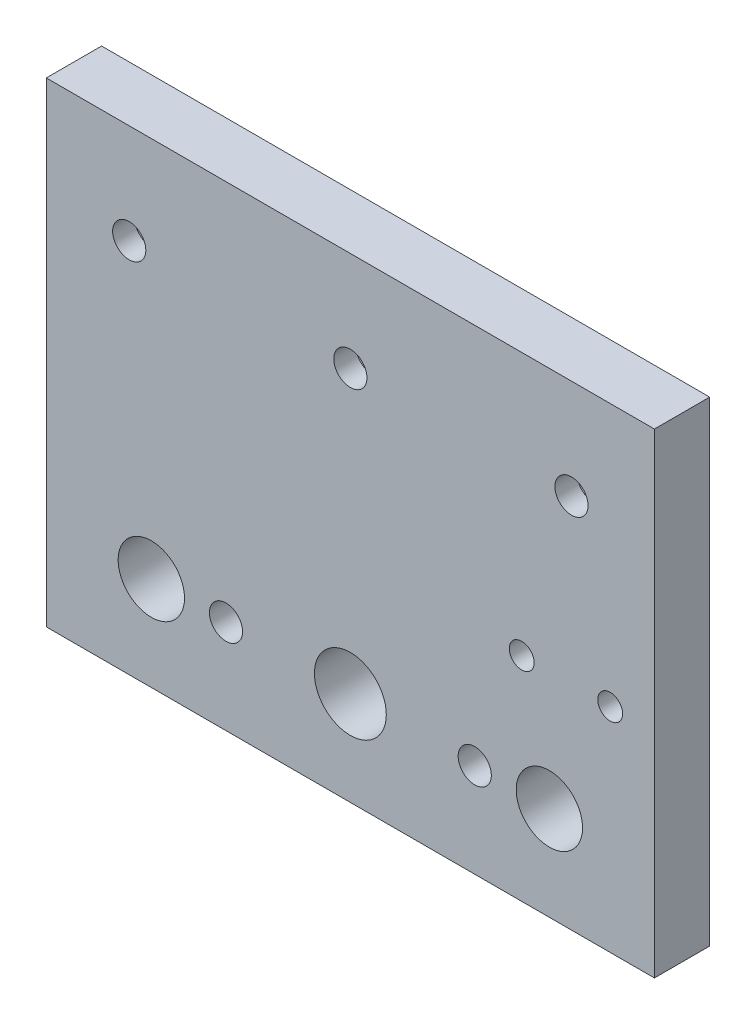
ISO-10303-21;
HEADER;
FILE_DESCRIPTION(('STEP AP214'),'2;1');
FILE_NAME('part.step','',(''),(''),'','','');
FILE_SCHEMA(('AUTOMOTIVE_DESIGN { 1 0 10303 214 1 1 1 1 }'));
ENDSEC;
DATA;
#1=APPLICATION_CONTEXT('core data for automotive mechanical design processes');
#2=APPLICATION_PROTOCOL_DEFINITION('international standard','automotive_design',2000,#1);
#3=PRODUCT_CONTEXT('',#1,'mechanical');
#4=PRODUCT('Part','Part','',(#3));
#5=PRODUCT_RELATED_PRODUCT_CATEGORY('part','',(#4));
#6=PRODUCT_DEFINITION_FORMATION('','',#4);
#7=PRODUCT_DEFINITION_CONTEXT('part definition',#1,'design');
#8=PRODUCT_DEFINITION('design','',#6,#7);
#9=PRODUCT_DEFINITION_SHAPE('','',#8);
#10=(LENGTH_UNIT() NAMED_UNIT(*) SI_UNIT(.MILLI.,.METRE.));
#11=(NAMED_UNIT(*) PLANE_ANGLE_UNIT() SI_UNIT($,.RADIAN.));
#12=(NAMED_UNIT(*) SI_UNIT($,.STERADIAN.) SOLID_ANGLE_UNIT());
#13=UNCERTAINTY_MEASURE_WITH_UNIT(LENGTH_MEASURE(1.E-05),#10,'distance_accuracy_value','');
#14=(GEOMETRIC_REPRESENTATION_CONTEXT(3) GLOBAL_UNCERTAINTY_ASSIGNED_CONTEXT((#13)) GLOBAL_UNIT_ASSIGNED_CONTEXT((#10,
#11,#12)) REPRESENTATION_CONTEXT('',''));
#15=CARTESIAN_POINT('',(0.,0.,0.));
#16=DIRECTION('',(0.,0.,1.));
#17=DIRECTION('',(1.,0.,0.));
#18=AXIS2_PLACEMENT_3D('',#15,#16,#17);
#19=CARTESIAN_POINT('',(0.,25.,10.0000000000001));
#20=DIRECTION('',(0.,0.,-1.));
#21=DIRECTION('',(-1.,0.,0.));
#22=AXIS2_PLACEMENT_3D('',#19,#20,#21);
#23=CYLINDRICAL_SURFACE('',#22,3.);
#24=CARTESIAN_POINT('',(0.,25.,10.0000000000001));
#25=DIRECTION('',(0.,0.,1.));
#26=DIRECTION('',(1.,0.,0.));
#27=AXIS2_PLACEMENT_3D('',#24,#25,#26);
#28=CIRCLE('',#27,3.);
#29=CARTESIAN_POINT('',(3.,25.,10.0000000000001));
#30=VERTEX_POINT('',#29);
#31=EDGE_CURVE('E126',#30,#30,#28,.T.);
#32=ORIENTED_EDGE('',*,*,#31,.T.);
#33=EDGE_LOOP('',(#32));
#34=FACE_BOUND('',#33,.T.);
#35=CARTESIAN_POINT('',(0.,25.,6.));
#36=DIRECTION('',(0.,0.,-1.));
#37=DIRECTION('',(-1.,0.,0.));
#38=AXIS2_PLACEMENT_3D('',#35,#36,#37);
#39=CIRCLE('',#38,3.);
#40=CARTESIAN_POINT('',(-3.,25.,6.));
#41=VERTEX_POINT('',#40);
#42=EDGE_CURVE('E21',#41,#41,#39,.T.);
#43=ORIENTED_EDGE('',*,*,#42,.T.);
#44=EDGE_LOOP('',(#43));
#45=FACE_BOUND('',#44,.T.);
#46=ADVANCED_FACE('F17',(#34,#45),#23,.F.);
#47=CARTESIAN_POINT('',(40.,25.,10.));
#48=DIRECTION('',(0.,0.,-1.));
#49=DIRECTION('',(-1.,0.,0.));
#50=AXIS2_PLACEMENT_3D('',#47,#48,#49);
#51=CYLINDRICAL_SURFACE('',#50,3.);
#52=CARTESIAN_POINT('',(40.,25.,10.));
#53=DIRECTION('',(0.,0.,1.));
#54=DIRECTION('',(1.,0.,0.));
#55=AXIS2_PLACEMENT_3D('',#52,#53,#54);
#56=CIRCLE('',#55,3.);
#57=CARTESIAN_POINT('',(43.,25.,10.));
#58=VERTEX_POINT('',#57);
#59=EDGE_CURVE('E123',#58,#58,#56,.T.);
#60=ORIENTED_EDGE('',*,*,#59,.T.);
#61=EDGE_LOOP('',(#60));
#62=FACE_BOUND('',#61,.T.);
#63=CARTESIAN_POINT('',(40.,25.,5.99999999999989));
#64=DIRECTION('',(0.,0.,-1.));
#65=DIRECTION('',(-1.,0.,0.));
#66=AXIS2_PLACEMENT_3D('',#63,#64,#65);
#67=CIRCLE('',#66,3.);
#68=CARTESIAN_POINT('',(37.,25.,5.99999999999989));
#69=VERTEX_POINT('',#68);
#70=EDGE_CURVE('E96',#69,#69,#67,.T.);
#71=ORIENTED_EDGE('',*,*,#70,.T.);
#72=EDGE_LOOP('',(#71));
#73=FACE_BOUND('',#72,.T.);
#74=ADVANCED_FACE('F180',(#62,#73),#51,.F.);
#75=CARTESIAN_POINT('',(-40.,25.,10.));
#76=DIRECTION('',(0.,0.,-1.));
#77=DIRECTION('',(-1.,0.,0.));
#78=AXIS2_PLACEMENT_3D('',#75,#76,#77);
#79=CYLINDRICAL_SURFACE('',#78,3.);
#80=CARTESIAN_POINT('',(-40.,25.,10.));
#81=DIRECTION('',(0.,0.,1.));
#82=DIRECTION('',(1.,0.,0.));
#83=AXIS2_PLACEMENT_3D('',#80,#81,#82);
#84=CIRCLE('',#83,3.);
#85=CARTESIAN_POINT('',(-37.,25.,10.));
#86=VERTEX_POINT('',#85);
#87=EDGE_CURVE('E118',#86,#86,#84,.T.);
#88=ORIENTED_EDGE('',*,*,#87,.T.);
#89=EDGE_LOOP('',(#88));
#90=FACE_BOUND('',#89,.T.);
#91=CARTESIAN_POINT('',(-40.,25.,6.00000000000009));
#92=DIRECTION('',(0.,0.,-1.));
#93=DIRECTION('',(-1.,0.,0.));
#94=AXIS2_PLACEMENT_3D('',#91,#92,#93);
#95=CIRCLE('',#94,3.);
#96=CARTESIAN_POINT('',(-43.,25.,6.00000000000009));
#97=VERTEX_POINT('',#96);
#98=EDGE_CURVE('E94',#97,#97,#95,.T.);
#99=ORIENTED_EDGE('',*,*,#98,.T.);
#100=EDGE_LOOP('',(#99));
#101=FACE_BOUND('',#100,.T.);
#102=ADVANCED_FACE('F187',(#90,#101),#79,.F.);
#103=CARTESIAN_POINT('',(0.,-1.11022302462516E-13,10.));
#104=DIRECTION('',(0.,0.,-1.));
#105=DIRECTION('',(-1.,0.,0.));
#106=AXIS2_PLACEMENT_3D('',#103,#104,#105);
#107=PLANE('',#106);
#108=DIRECTION('',(0.,-1.,0.));
#109=VECTOR('',#108,1.);
#110=CARTESIAN_POINT('',(-55.,43.,10.));
#111=LINE('',#110,#109);
#112=CARTESIAN_POINT('',(-55.,43.,10.));
#113=VERTEX_POINT('',#112);
#114=CARTESIAN_POINT('',(-55.,-43.,10.0000000000002));
#115=VERTEX_POINT('',#114);
#116=EDGE_CURVE('E72',#113,#115,#111,.T.);
#117=ORIENTED_EDGE('',*,*,#116,.T.);
#118=DIRECTION('',(1.,0.,0.));
#119=VECTOR('',#118,1.);
#120=CARTESIAN_POINT('',(55.,-43.,10.0000000000002));
#121=LINE('',#120,#119);
#122=CARTESIAN_POINT('',(55.,-43.,10.0000000000002));
#123=VERTEX_POINT('',#122);
#124=EDGE_CURVE('E66',#115,#123,#121,.T.);
#125=ORIENTED_EDGE('',*,*,#124,.T.);
#126=DIRECTION('',(0.,1.,0.));
#127=VECTOR('',#126,1.);
#128=CARTESIAN_POINT('',(55.,43.,10.));
#129=LINE('',#128,#127);
#130=CARTESIAN_POINT('',(55.,43.,10.));
#131=VERTEX_POINT('',#130);
#132=EDGE_CURVE('E70',#123,#131,#129,.T.);
#133=ORIENTED_EDGE('',*,*,#132,.T.);
#134=DIRECTION('',(-1.,0.,0.));
#135=VECTOR('',#134,1.);
#136=CARTESIAN_POINT('',(55.,43.,10.));
#137=LINE('',#136,#135);
#138=EDGE_CURVE('E36',#131,#113,#137,.T.);
#139=ORIENTED_EDGE('',*,*,#138,.T.);
#140=EDGE_LOOP('',(#117,#125,#133,#139));
#141=FACE_BOUND('',#140,.T.);
#142=CARTESIAN_POINT('',(36.,-26.,10.0000000000001));
#143=DIRECTION('',(0.,0.,1.));
#144=DIRECTION('',(1.,0.,0.));
#145=AXIS2_PLACEMENT_3D('',#142,#143,#144);
#146=CIRCLE('',#145,6.);
#147=CARTESIAN_POINT('',(42.,-26.,10.0000000000001));
#148=VERTEX_POINT('',#147);
#149=EDGE_CURVE('E88',#148,#148,#146,.T.);
#150=ORIENTED_EDGE('',*,*,#149,.F.);
#151=EDGE_LOOP('',(#150));
#152=FACE_BOUND('',#151,.T.);
#153=CARTESIAN_POINT('',(0.,-26.,10.0000000000002));
#154=DIRECTION('',(0.,0.,1.));
#155=DIRECTION('',(1.,0.,0.));
#156=AXIS2_PLACEMENT_3D('',#153,#154,#155);
#157=CIRCLE('',#156,6.5);
#158=CARTESIAN_POINT('',(6.50000000000003,-26.,10.0000000000002));
#159=VERTEX_POINT('',#158);
#160=EDGE_CURVE('E148',#159,#159,#157,.T.);
#161=ORIENTED_EDGE('',*,*,#160,.F.);
#162=EDGE_LOOP('',(#161));
#163=FACE_BOUND('',#162,.T.);
#164=CARTESIAN_POINT('',(-36.,-26.,10.0000000000002));
#165=DIRECTION('',(0.,0.,1.));
#166=DIRECTION('',(1.,0.,0.));
#167=AXIS2_PLACEMENT_3D('',#164,#165,#166);
#168=CIRCLE('',#167,6.);
#169=CARTESIAN_POINT('',(-30.,-26.,10.0000000000002));
#170=VERTEX_POINT('',#169);
#171=EDGE_CURVE('E142',#170,#170,#168,.T.);
#172=ORIENTED_EDGE('',*,*,#171,.F.);
#173=EDGE_LOOP('',(#172));
#174=FACE_BOUND('',#173,.T.);
#175=CARTESIAN_POINT('',(22.5,-26.,10.0000000000001));
#176=DIRECTION('',(0.,0.,1.));
#177=DIRECTION('',(1.,0.,0.));
#178=AXIS2_PLACEMENT_3D('',#175,#176,#177);
#179=CIRCLE('',#178,3.);
#180=CARTESIAN_POINT('',(25.5,-26.,10.0000000000001));
#181=VERTEX_POINT('',#180);
#182=EDGE_CURVE('E136',#181,#181,#179,.T.);
#183=ORIENTED_EDGE('',*,*,#182,.F.);
#184=EDGE_LOOP('',(#183));
#185=FACE_BOUND('',#184,.T.);
#186=CARTESIAN_POINT('',(-22.5,-26.,10.0000000000002));
#187=DIRECTION('',(0.,0.,1.));
#188=DIRECTION('',(1.,0.,0.));
#189=AXIS2_PLACEMENT_3D('',#186,#187,#188);
#190=CIRCLE('',#189,3.);
#191=CARTESIAN_POINT('',(-19.5,-26.,10.0000000000002));
#192=VERTEX_POINT('',#191);
#193=EDGE_CURVE('E130',#192,#192,#190,.T.);
#194=ORIENTED_EDGE('',*,*,#193,.F.);
#195=EDGE_LOOP('',(#194));
#196=FACE_BOUND('',#195,.T.);
#197=ORIENTED_EDGE('',*,*,#31,.F.);
#198=EDGE_LOOP('',(#197));
#199=FACE_BOUND('',#198,.T.);
#200=ORIENTED_EDGE('',*,*,#59,.F.);
#201=EDGE_LOOP('',(#200));
#202=FACE_BOUND('',#201,.T.);
#203=ORIENTED_EDGE('',*,*,#87,.F.);
#204=EDGE_LOOP('',(#203));
#205=FACE_BOUND('',#204,.T.);
#206=CARTESIAN_POINT('',(47.,-4.5,10.));
#207=DIRECTION('',(0.,0.,1.));
#208=DIRECTION('',(1.,0.,0.));
#209=AXIS2_PLACEMENT_3D('',#206,#207,#208);
#210=CIRCLE('',#209,2.25);
#211=CARTESIAN_POINT('',(49.25,-4.5,10.));
#212=VERTEX_POINT('',#211);
#213=EDGE_CURVE('E115',#212,#212,#210,.T.);
#214=ORIENTED_EDGE('',*,*,#213,.F.);
#215=EDGE_LOOP('',(#214));
#216=FACE_BOUND('',#215,.T.);
#217=CARTESIAN_POINT('',(31.,-4.5000000000001,10.));
#218=DIRECTION('',(0.,0.,1.));
#219=DIRECTION('',(1.,0.,0.));
#220=AXIS2_PLACEMENT_3D('',#217,#218,#219);
#221=CIRCLE('',#220,2.25);
#222=CARTESIAN_POINT('',(33.25,-4.5000000000001,10.));
#223=VERTEX_POINT('',#222);
#224=EDGE_CURVE('E106',#223,#223,#221,.T.);
#225=ORIENTED_EDGE('',*,*,#224,.F.);
#226=EDGE_LOOP('',(#225));
#227=FACE_BOUND('',#226,.T.);
#228=ADVANCED_FACE('F67',(#141,#152,#163,#174,#185,#196,#199,#202,#205,#216,#227),#107,.F.);
#229=CARTESIAN_POINT('',(0.,0.,0.));
#230=DIRECTION('',(0.,0.,-1.));
#231=DIRECTION('',(-1.,0.,0.));
#232=AXIS2_PLACEMENT_3D('',#229,#230,#231);
#233=PLANE('',#232);
#234=CARTESIAN_POINT('',(40.,25.,-1.94289029309402E-13));
#235=DIRECTION('',(0.,0.,-1.));
#236=DIRECTION('',(-1.,0.,0.));
#237=AXIS2_PLACEMENT_3D('',#234,#235,#236);
#238=CIRCLE('',#237,5.5);
#239=CARTESIAN_POINT('',(34.5,25.,-1.91698499658684E-13));
#240=VERTEX_POINT('',#239);
#241=EDGE_CURVE('E404',#240,#240,#238,.T.);
#242=ORIENTED_EDGE('',*,*,#241,.F.);
#243=EDGE_LOOP('',(#242));
#244=FACE_BOUND('',#243,.T.);
#245=CARTESIAN_POINT('',(0.,25.,0.));
#246=DIRECTION('',(0.,0.,-1.));
#247=DIRECTION('',(-1.,0.,0.));
#248=AXIS2_PLACEMENT_3D('',#245,#246,#247);
#249=CIRCLE('',#248,5.5);
#250=CARTESIAN_POINT('',(-5.5,25.,0.));
#251=VERTEX_POINT('',#250);
#252=EDGE_CURVE('E396',#251,#251,#249,.T.);
#253=ORIENTED_EDGE('',*,*,#252,.F.);
#254=EDGE_LOOP('',(#253));
#255=FACE_BOUND('',#254,.T.);
#256=CARTESIAN_POINT('',(-40.,25.,0.));
#257=DIRECTION('',(0.,0.,-1.));
#258=DIRECTION('',(-1.,0.,0.));
#259=AXIS2_PLACEMENT_3D('',#256,#257,#258);
#260=CIRCLE('',#259,5.5);
#261=CARTESIAN_POINT('',(-45.5,25.,0.));
#262=VERTEX_POINT('',#261);
#263=EDGE_CURVE('E394',#262,#262,#260,.T.);
#264=ORIENTED_EDGE('',*,*,#263,.F.);
#265=EDGE_LOOP('',(#264));
#266=FACE_BOUND('',#265,.T.);
#267=CARTESIAN_POINT('',(47.,-4.5000000000001,0.));
#268=DIRECTION('',(0.,0.,1.));
#269=DIRECTION('',(1.,0.,0.));
#270=AXIS2_PLACEMENT_3D('',#267,#268,#269);
#271=CIRCLE('',#270,2.25);
#272=CARTESIAN_POINT('',(49.25,-4.5000000000001,0.));
#273=VERTEX_POINT('',#272);
#274=EDGE_CURVE('E111',#273,#273,#271,.T.);
#275=ORIENTED_EDGE('',*,*,#274,.T.);
#276=EDGE_LOOP('',(#275));
#277=FACE_BOUND('',#276,.T.);
#278=CARTESIAN_POINT('',(-22.5,-26.,1.94289029309402E-13));
#279=DIRECTION('',(0.,0.,1.));
#280=DIRECTION('',(1.,0.,0.));
#281=AXIS2_PLACEMENT_3D('',#278,#279,#280);
#282=CIRCLE('',#281,3.);
#283=CARTESIAN_POINT('',(-19.5,-26.,1.92876013136283E-13));
#284=VERTEX_POINT('',#283);
#285=EDGE_CURVE('E129',#284,#284,#282,.T.);
#286=ORIENTED_EDGE('',*,*,#285,.T.);
#287=EDGE_LOOP('',(#286));
#288=FACE_BOUND('',#287,.T.);
#289=CARTESIAN_POINT('',(-36.,-26.,1.94289029309402E-13));
#290=DIRECTION('',(0.,0.,1.));
#291=DIRECTION('',(1.,0.,0.));
#292=AXIS2_PLACEMENT_3D('',#289,#290,#291);
#293=CIRCLE('',#292,6.);
#294=CARTESIAN_POINT('',(-30.,-26.,1.91462996963164E-13));
#295=VERTEX_POINT('',#294);
#296=EDGE_CURVE('E139',#295,#295,#293,.T.);
#297=ORIENTED_EDGE('',*,*,#296,.T.);
#298=EDGE_LOOP('',(#297));
#299=FACE_BOUND('',#298,.T.);
#300=CARTESIAN_POINT('',(36.,-26.,0.));
#301=DIRECTION('',(0.,0.,1.));
#302=DIRECTION('',(1.,0.,0.));
#303=AXIS2_PLACEMENT_3D('',#300,#301,#302);
#304=CIRCLE('',#303,6.);
#305=CARTESIAN_POINT('',(42.,-26.,0.));
#306=VERTEX_POINT('',#305);
#307=EDGE_CURVE('E151',#306,#306,#304,.T.);
#308=ORIENTED_EDGE('',*,*,#307,.T.);
#309=EDGE_LOOP('',(#308));
#310=FACE_BOUND('',#309,.T.);
#311=DIRECTION('',(0.,-1.,0.));
#312=VECTOR('',#311,1.);
#313=CARTESIAN_POINT('',(-55.,43.,0.));
#314=LINE('',#313,#312);
#315=CARTESIAN_POINT('',(-55.,43.,0.));
#316=VERTEX_POINT('',#315);
#317=CARTESIAN_POINT('',(-55.,-43.,2.22044604925032E-13));
#318=VERTEX_POINT('',#317);
#319=EDGE_CURVE('E85',#316,#318,#314,.T.);
#320=ORIENTED_EDGE('',*,*,#319,.F.);
#321=DIRECTION('',(-1.,0.,0.));
#322=VECTOR('',#321,1.);
#323=CARTESIAN_POINT('',(55.,43.,-1.94289029309402E-13));
#324=LINE('',#323,#322);
#325=CARTESIAN_POINT('',(55.,43.,-1.94289029309402E-13));
#326=VERTEX_POINT('',#325);
#327=EDGE_CURVE('E59',#326,#316,#324,.T.);
#328=ORIENTED_EDGE('',*,*,#327,.F.);
#329=DIRECTION('',(0.,1.,0.));
#330=VECTOR('',#329,1.);
#331=CARTESIAN_POINT('',(55.,43.,-1.94289029309402E-13));
#332=LINE('',#331,#330);
#333=CARTESIAN_POINT('',(55.,-43.,1.94289029309402E-13));
#334=VERTEX_POINT('',#333);
#335=EDGE_CURVE('E53',#334,#326,#332,.T.);
#336=ORIENTED_EDGE('',*,*,#335,.F.);
#337=DIRECTION('',(1.,0.,0.));
#338=VECTOR('',#337,1.);
#339=CARTESIAN_POINT('',(55.,-43.,1.94289029309402E-13));
#340=LINE('',#339,#338);
#341=EDGE_CURVE('E76',#318,#334,#340,.T.);
#342=ORIENTED_EDGE('',*,*,#341,.F.);
#343=EDGE_LOOP('',(#320,#328,#336,#342));
#344=FACE_BOUND('',#343,.T.);
#345=CARTESIAN_POINT('',(0.,-26.,1.94289029309402E-13));
#346=DIRECTION('',(0.,0.,1.));
#347=DIRECTION('',(1.,0.,0.));
#348=AXIS2_PLACEMENT_3D('',#345,#346,#347);
#349=CIRCLE('',#348,6.5);
#350=CARTESIAN_POINT('',(6.50000000000003,-26.,1.91227494267644E-13));
#351=VERTEX_POINT('',#350);
#352=EDGE_CURVE('E145',#351,#351,#349,.T.);
#353=ORIENTED_EDGE('',*,*,#352,.T.);
#354=EDGE_LOOP('',(#353));
#355=FACE_BOUND('',#354,.T.);
#356=CARTESIAN_POINT('',(22.5,-26.,0.));
#357=DIRECTION('',(0.,0.,1.));
#358=DIRECTION('',(1.,0.,0.));
#359=AXIS2_PLACEMENT_3D('',#356,#357,#358);
#360=CIRCLE('',#359,3.);
#361=CARTESIAN_POINT('',(25.5,-26.,0.));
#362=VERTEX_POINT('',#361);
#363=EDGE_CURVE('E133',#362,#362,#360,.T.);
#364=ORIENTED_EDGE('',*,*,#363,.T.);
#365=EDGE_LOOP('',(#364));
#366=FACE_BOUND('',#365,.T.);
#367=CARTESIAN_POINT('',(31.,-4.50000000000011,0.));
#368=DIRECTION('',(0.,0.,1.));
#369=DIRECTION('',(1.,0.,0.));
#370=AXIS2_PLACEMENT_3D('',#367,#368,#369);
#371=CIRCLE('',#370,2.25);
#372=CARTESIAN_POINT('',(33.25,-4.50000000000011,0.));
#373=VERTEX_POINT('',#372);
#374=EDGE_CURVE('E102',#373,#373,#371,.T.);
#375=ORIENTED_EDGE('',*,*,#374,.T.);
#376=EDGE_LOOP('',(#375));
#377=FACE_BOUND('',#376,.T.);
#378=ADVANCED_FACE('F159',(#244,#255,#266,#277,#288,#299,#310,#344,#355,#366,#377),#233,.T.);
#379=CARTESIAN_POINT('',(-55.,43.,10.));
#380=DIRECTION('',(1.,0.,0.));
#381=DIRECTION('',(0.,1.,0.));
#382=AXIS2_PLACEMENT_3D('',#379,#380,#381);
#383=PLANE('',#382);
#384=ORIENTED_EDGE('',*,*,#319,.T.);
#385=DIRECTION('',(0.,0.,-1.));
#386=VECTOR('',#385,1.);
#387=CARTESIAN_POINT('',(-55.,-43.,10.0000000000002));
#388=LINE('',#387,#386);
#389=EDGE_CURVE('E11',#115,#318,#388,.T.);
#390=ORIENTED_EDGE('',*,*,#389,.F.);
#391=ORIENTED_EDGE('',*,*,#116,.F.);
#392=DIRECTION('',(0.,0.,-1.));
#393=VECTOR('',#392,1.);
#394=CARTESIAN_POINT('',(-55.,43.,10.));
#395=LINE('',#394,#393);
#396=EDGE_CURVE('E81',#113,#316,#395,.T.);
#397=ORIENTED_EDGE('',*,*,#396,.T.);
#398=EDGE_LOOP('',(#384,#390,#391,#397));
#399=FACE_BOUND('',#398,.T.);
#400=ADVANCED_FACE('F19',(#399),#383,.F.);
#401=CARTESIAN_POINT('',(55.,-43.,10.0000000000002));
#402=DIRECTION('',(0.,1.,0.));
#403=DIRECTION('',(-1.,0.,0.));
#404=AXIS2_PLACEMENT_3D('',#401,#402,#403);
#405=PLANE('',#404);
#406=ORIENTED_EDGE('',*,*,#341,.T.);
#407=DIRECTION('',(0.,0.,-1.));
#408=VECTOR('',#407,1.);
#409=CARTESIAN_POINT('',(55.,-43.,10.0000000000002));
#410=LINE('',#409,#408);
#411=EDGE_CURVE('E27',#123,#334,#410,.T.);
#412=ORIENTED_EDGE('',*,*,#411,.F.);
#413=ORIENTED_EDGE('',*,*,#124,.F.);
#414=ORIENTED_EDGE('',*,*,#389,.T.);
#415=EDGE_LOOP('',(#406,#412,#413,#414));
#416=FACE_BOUND('',#415,.T.);
#417=ADVANCED_FACE('F75',(#416),#405,.F.);
#418=CARTESIAN_POINT('',(55.,43.,10.));
#419=DIRECTION('',(-1.,0.,0.));
#420=DIRECTION('',(0.,-1.,0.));
#421=AXIS2_PLACEMENT_3D('',#418,#419,#420);
#422=PLANE('',#421);
#423=ORIENTED_EDGE('',*,*,#335,.T.);
#424=DIRECTION('',(0.,0.,-1.));
#425=VECTOR('',#424,1.);
#426=CARTESIAN_POINT('',(55.,43.,10.));
#427=LINE('',#426,#425);
#428=EDGE_CURVE('E77',#131,#326,#427,.T.);
#429=ORIENTED_EDGE('',*,*,#428,.F.);
#430=ORIENTED_EDGE('',*,*,#132,.F.);
#431=ORIENTED_EDGE('',*,*,#411,.T.);
#432=EDGE_LOOP('',(#423,#429,#430,#431));
#433=FACE_BOUND('',#432,.T.);
#434=ADVANCED_FACE('F79',(#433),#422,.F.);
#435=CARTESIAN_POINT('',(55.,43.,10.));
#436=DIRECTION('',(0.,-1.,0.));
#437=DIRECTION('',(1.,0.,0.));
#438=AXIS2_PLACEMENT_3D('',#435,#436,#437);
#439=PLANE('',#438);
#440=ORIENTED_EDGE('',*,*,#327,.T.);
#441=ORIENTED_EDGE('',*,*,#396,.F.);
#442=ORIENTED_EDGE('',*,*,#138,.F.);
#443=ORIENTED_EDGE('',*,*,#428,.T.);
#444=EDGE_LOOP('',(#440,#441,#442,#443));
#445=FACE_BOUND('',#444,.T.);
#446=ADVANCED_FACE('F165',(#445),#439,.F.);
#447=CARTESIAN_POINT('',(36.,-26.,10.0000000000001));
#448=DIRECTION('',(0.,0.,-1.));
#449=DIRECTION('',(-1.,0.,0.));
#450=AXIS2_PLACEMENT_3D('',#447,#448,#449);
#451=CYLINDRICAL_SURFACE('',#450,6.);
#452=ORIENTED_EDGE('',*,*,#149,.T.);
#453=EDGE_LOOP('',(#452));
#454=FACE_BOUND('',#453,.T.);
#455=ORIENTED_EDGE('',*,*,#307,.F.);
#456=EDGE_LOOP('',(#455));
#457=FACE_BOUND('',#456,.T.);
#458=ADVANCED_FACE('F162',(#454,#457),#451,.F.);
#459=CARTESIAN_POINT('',(0.,-26.,10.0000000000002));
#460=DIRECTION('',(0.,0.,-1.));
#461=DIRECTION('',(-1.,0.,0.));
#462=AXIS2_PLACEMENT_3D('',#459,#460,#461);
#463=CYLINDRICAL_SURFACE('',#462,6.5);
#464=ORIENTED_EDGE('',*,*,#160,.T.);
#465=EDGE_LOOP('',(#464));
#466=FACE_BOUND('',#465,.T.);
#467=ORIENTED_EDGE('',*,*,#352,.F.);
#468=EDGE_LOOP('',(#467));
#469=FACE_BOUND('',#468,.T.);
#470=ADVANCED_FACE('F164',(#466,#469),#463,.F.);
#471=CARTESIAN_POINT('',(-36.,-26.,10.0000000000002));
#472=DIRECTION('',(0.,0.,-1.));
#473=DIRECTION('',(-1.,0.,0.));
#474=AXIS2_PLACEMENT_3D('',#471,#472,#473);
#475=CYLINDRICAL_SURFACE('',#474,6.);
#476=ORIENTED_EDGE('',*,*,#171,.T.);
#477=EDGE_LOOP('',(#476));
#478=FACE_BOUND('',#477,.T.);
#479=ORIENTED_EDGE('',*,*,#296,.F.);
#480=EDGE_LOOP('',(#479));
#481=FACE_BOUND('',#480,.T.);
#482=ADVANCED_FACE('F174',(#478,#481),#475,.F.);
#483=CARTESIAN_POINT('',(22.5,-26.,10.0000000000001));
#484=DIRECTION('',(0.,0.,-1.));
#485=DIRECTION('',(-1.,0.,0.));
#486=AXIS2_PLACEMENT_3D('',#483,#484,#485);
#487=CYLINDRICAL_SURFACE('',#486,3.);
#488=ORIENTED_EDGE('',*,*,#182,.T.);
#489=EDGE_LOOP('',(#488));
#490=FACE_BOUND('',#489,.T.);
#491=ORIENTED_EDGE('',*,*,#363,.F.);
#492=EDGE_LOOP('',(#491));
#493=FACE_BOUND('',#492,.T.);
#494=ADVANCED_FACE('F196',(#490,#493),#487,.F.);
#495=CARTESIAN_POINT('',(-22.5,-26.,10.0000000000002));
#496=DIRECTION('',(0.,0.,-1.));
#497=DIRECTION('',(-1.,0.,0.));
#498=AXIS2_PLACEMENT_3D('',#495,#496,#497);
#499=CYLINDRICAL_SURFACE('',#498,3.);
#500=ORIENTED_EDGE('',*,*,#193,.T.);
#501=EDGE_LOOP('',(#500));
#502=FACE_BOUND('',#501,.T.);
#503=ORIENTED_EDGE('',*,*,#285,.F.);
#504=EDGE_LOOP('',(#503));
#505=FACE_BOUND('',#504,.T.);
#506=ADVANCED_FACE('F192',(#502,#505),#499,.F.);
#507=CARTESIAN_POINT('',(47.,-4.5,10.));
#508=DIRECTION('',(0.,0.,-1.));
#509=DIRECTION('',(-1.,0.,0.));
#510=AXIS2_PLACEMENT_3D('',#507,#508,#509);
#511=CYLINDRICAL_SURFACE('',#510,2.25);
#512=ORIENTED_EDGE('',*,*,#213,.T.);
#513=EDGE_LOOP('',(#512));
#514=FACE_BOUND('',#513,.T.);
#515=ORIENTED_EDGE('',*,*,#274,.F.);
#516=EDGE_LOOP('',(#515));
#517=FACE_BOUND('',#516,.T.);
#518=ADVANCED_FACE('F195',(#514,#517),#511,.F.);
#519=CARTESIAN_POINT('',(31.,-4.5000000000001,10.));
#520=DIRECTION('',(0.,0.,-1.));
#521=DIRECTION('',(-1.,0.,0.));
#522=AXIS2_PLACEMENT_3D('',#519,#520,#521);
#523=CYLINDRICAL_SURFACE('',#522,2.25);
#524=ORIENTED_EDGE('',*,*,#224,.T.);
#525=EDGE_LOOP('',(#524));
#526=FACE_BOUND('',#525,.T.);
#527=ORIENTED_EDGE('',*,*,#374,.F.);
#528=EDGE_LOOP('',(#527));
#529=FACE_BOUND('',#528,.T.);
#530=ADVANCED_FACE('F356',(#526,#529),#523,.F.);
#531=CARTESIAN_POINT('',(-40.,25.,6.00000000000009));
#532=DIRECTION('',(0.,0.,-1.));
#533=DIRECTION('',(-1.,0.,0.));
#534=AXIS2_PLACEMENT_3D('',#531,#532,#533);
#535=CYLINDRICAL_SURFACE('',#534,5.5);
#536=CARTESIAN_POINT('',(-40.,25.,6.00000000000009));
#537=DIRECTION('',(0.,0.,-1.));
#538=DIRECTION('',(-1.,0.,0.));
#539=AXIS2_PLACEMENT_3D('',#536,#537,#538);
#540=CIRCLE('',#539,5.5);
#541=CARTESIAN_POINT('',(-45.5,25.,6.00000000000009));
#542=VERTEX_POINT('',#541);
#543=EDGE_CURVE('E391',#542,#542,#540,.T.);
#544=ORIENTED_EDGE('',*,*,#543,.F.);
#545=EDGE_LOOP('',(#544));
#546=FACE_BOUND('',#545,.T.);
#547=ORIENTED_EDGE('',*,*,#263,.T.);
#548=EDGE_LOOP('',(#547));
#549=FACE_BOUND('',#548,.T.);
#550=ADVANCED_FACE('F346',(#546,#549),#535,.F.);
#551=CARTESIAN_POINT('',(-40.,25.,6.00000000000009));
#552=DIRECTION('',(0.,0.,-1.));
#553=DIRECTION('',(-1.,0.,0.));
#554=AXIS2_PLACEMENT_3D('',#551,#552,#553);
#555=PLANE('',#554);
#556=ORIENTED_EDGE('',*,*,#98,.F.);
#557=EDGE_LOOP('',(#556));
#558=FACE_BOUND('',#557,.T.);
#559=ORIENTED_EDGE('',*,*,#543,.T.);
#560=EDGE_LOOP('',(#559));
#561=FACE_BOUND('',#560,.T.);
#562=ADVANCED_FACE('F336',(#558,#561),#555,.T.);
#563=CARTESIAN_POINT('',(40.,25.,5.99999999999989));
#564=DIRECTION('',(0.,0.,-1.));
#565=DIRECTION('',(-1.,0.,0.));
#566=AXIS2_PLACEMENT_3D('',#563,#564,#565);
#567=CYLINDRICAL_SURFACE('',#566,5.5);
#568=CARTESIAN_POINT('',(40.,25.,5.99999999999989));
#569=DIRECTION('',(0.,0.,-1.));
#570=DIRECTION('',(-1.,0.,0.));
#571=AXIS2_PLACEMENT_3D('',#568,#569,#570);
#572=CIRCLE('',#571,5.5);
#573=CARTESIAN_POINT('',(34.5,25.,5.99999999999989));
#574=VERTEX_POINT('',#573);
#575=EDGE_CURVE('E97',#574,#574,#572,.T.);
#576=ORIENTED_EDGE('',*,*,#575,.F.);
#577=EDGE_LOOP('',(#576));
#578=FACE_BOUND('',#577,.T.);
#579=ORIENTED_EDGE('',*,*,#241,.T.);
#580=EDGE_LOOP('',(#579));
#581=FACE_BOUND('',#580,.T.);
#582=ADVANCED_FACE('F326',(#578,#581),#567,.F.);
#583=CARTESIAN_POINT('',(40.,25.,5.99999999999989));
#584=DIRECTION('',(0.,0.,-1.));
#585=DIRECTION('',(-1.,0.,0.));
#586=AXIS2_PLACEMENT_3D('',#583,#584,#585);
#587=PLANE('',#586);
#588=ORIENTED_EDGE('',*,*,#70,.F.);
#589=EDGE_LOOP('',(#588));
#590=FACE_BOUND('',#589,.T.);
#591=ORIENTED_EDGE('',*,*,#575,.T.);
#592=EDGE_LOOP('',(#591));
#593=FACE_BOUND('',#592,.T.);
#594=ADVANCED_FACE('F316',(#590,#593),#587,.T.);
#595=CARTESIAN_POINT('',(0.,25.,6.));
#596=DIRECTION('',(0.,0.,-1.));
#597=DIRECTION('',(-1.,0.,0.));
#598=AXIS2_PLACEMENT_3D('',#595,#596,#597);
#599=CYLINDRICAL_SURFACE('',#598,5.5);
#600=CARTESIAN_POINT('',(0.,25.,6.));
#601=DIRECTION('',(0.,0.,-1.));
#602=DIRECTION('',(-1.,0.,0.));
#603=AXIS2_PLACEMENT_3D('',#600,#601,#602);
#604=CIRCLE('',#603,5.5);
#605=CARTESIAN_POINT('',(-5.5,25.,6.));
#606=VERTEX_POINT('',#605);
#607=EDGE_CURVE('E401',#606,#606,#604,.T.);
#608=ORIENTED_EDGE('',*,*,#607,.F.);
#609=EDGE_LOOP('',(#608));
#610=FACE_BOUND('',#609,.T.);
#611=ORIENTED_EDGE('',*,*,#252,.T.);
#612=EDGE_LOOP('',(#611));
#613=FACE_BOUND('',#612,.T.);
#614=ADVANCED_FACE('F306',(#610,#613),#599,.F.);
#615=CARTESIAN_POINT('',(0.,25.,6.));
#616=DIRECTION('',(0.,0.,-1.));
#617=DIRECTION('',(-1.,0.,0.));
#618=AXIS2_PLACEMENT_3D('',#615,#616,#617);
#619=PLANE('',#618);
#620=ORIENTED_EDGE('',*,*,#42,.F.);
#621=EDGE_LOOP('',(#620));
#622=FACE_BOUND('',#621,.T.);
#623=ORIENTED_EDGE('',*,*,#607,.T.);
#624=EDGE_LOOP('',(#623));
#625=FACE_BOUND('',#624,.T.);
#626=ADVANCED_FACE('F301',(#622,#625),#619,.T.);
#627=CLOSED_SHELL('',(#46,#74,#102,#228,#378,#400,#417,#434,#446,#458,#470,#482,#494,#506,#518,
#530,#550,#562,#582,#594,#614,#626));
#628=MANIFOLD_SOLID_BREP('B1',#627);
#629=ADVANCED_BREP_SHAPE_REPRESENTATION('',(#18,#628),#14);
#630=SHAPE_DEFINITION_REPRESENTATION(#9,#629);
ENDSEC;
END-ISO-10303-21;
